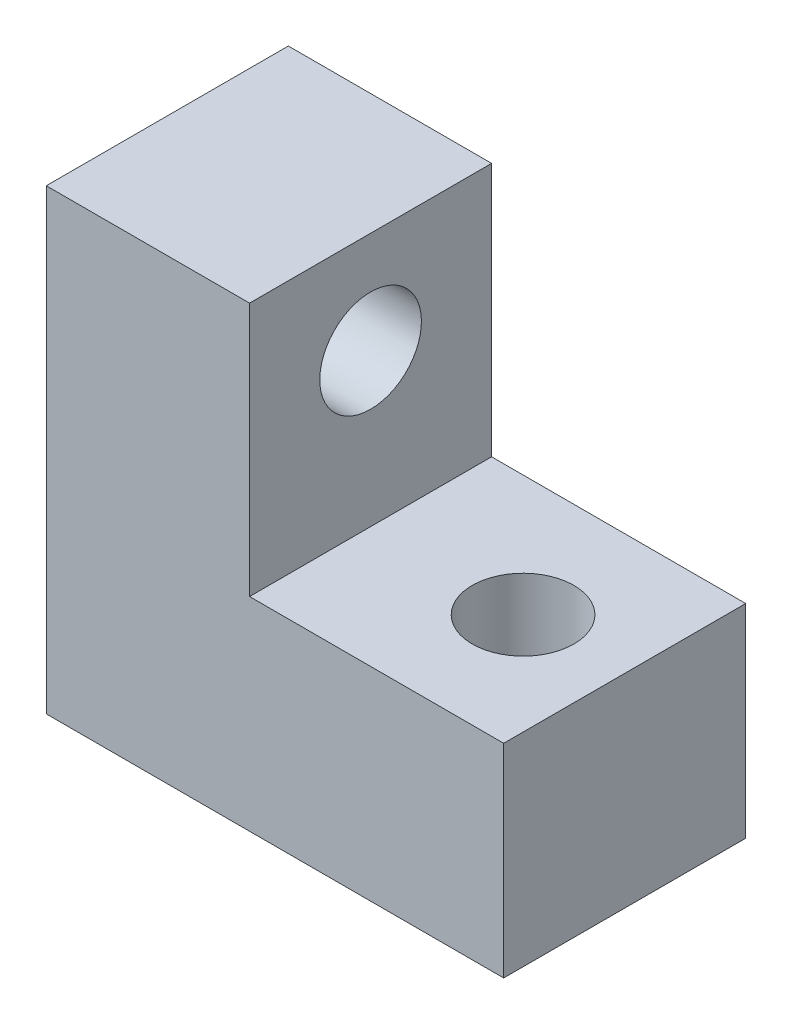
ISO-10303-21;
HEADER;
FILE_DESCRIPTION(('STEP AP214'),'2;1');
FILE_NAME('part.step','',(''),(''),'','','');
FILE_SCHEMA(('AUTOMOTIVE_DESIGN { 1 0 10303 214 1 1 1 1 }'));
ENDSEC;
DATA;
#1=APPLICATION_CONTEXT('core data for automotive mechanical design processes');
#2=APPLICATION_PROTOCOL_DEFINITION('international standard','automotive_design',2000,#1);
#3=PRODUCT_CONTEXT('',#1,'mechanical');
#4=PRODUCT('Part','Part','',(#3));
#5=PRODUCT_RELATED_PRODUCT_CATEGORY('part','',(#4));
#6=PRODUCT_DEFINITION_FORMATION('','',#4);
#7=PRODUCT_DEFINITION_CONTEXT('part definition',#1,'design');
#8=PRODUCT_DEFINITION('design','',#6,#7);
#9=PRODUCT_DEFINITION_SHAPE('','',#8);
#10=(LENGTH_UNIT() NAMED_UNIT(*) SI_UNIT(.MILLI.,.METRE.));
#11=(NAMED_UNIT(*) PLANE_ANGLE_UNIT() SI_UNIT($,.RADIAN.));
#12=(NAMED_UNIT(*) SI_UNIT($,.STERADIAN.) SOLID_ANGLE_UNIT());
#13=UNCERTAINTY_MEASURE_WITH_UNIT(LENGTH_MEASURE(1.E-05),#10,'distance_accuracy_value','');
#14=(GEOMETRIC_REPRESENTATION_CONTEXT(3) GLOBAL_UNCERTAINTY_ASSIGNED_CONTEXT((#13)) GLOBAL_UNIT_ASSIGNED_CONTEXT((#10,
#11,#12)) REPRESENTATION_CONTEXT('',''));
#15=CARTESIAN_POINT('',(0.,0.,0.));
#16=DIRECTION('',(0.,0.,1.));
#17=DIRECTION('',(1.,0.,0.));
#18=AXIS2_PLACEMENT_3D('',#15,#16,#17);
#19=CARTESIAN_POINT('',(0.,0.,9.525));
#20=DIRECTION('',(1.,0.,0.));
#21=DIRECTION('',(0.,1.,0.));
#22=AXIS2_PLACEMENT_3D('',#19,#20,#21);
#23=PLANE('',#22);
#24=CARTESIAN_POINT('',(0.,14.,4.7625));
#25=DIRECTION('',(-1.,0.,0.));
#26=DIRECTION('',(0.,-1.,0.));
#27=AXIS2_PLACEMENT_3D('',#24,#25,#26);
#28=CIRCLE('',#27,2.);
#29=CARTESIAN_POINT('',(0.,12.,4.7625));
#30=VERTEX_POINT('',#29);
#31=EDGE_CURVE('E183',#30,#30,#28,.T.);
#32=ORIENTED_EDGE('',*,*,#31,.F.);
#33=EDGE_LOOP('',(#32));
#34=FACE_BOUND('',#33,.T.);
#35=DIRECTION('',(0.,-1.,0.));
#36=VECTOR('',#35,1.);
#37=CARTESIAN_POINT('',(0.,0.,0.));
#38=LINE('',#37,#36);
#39=CARTESIAN_POINT('',(0.,18.,0.));
#40=VERTEX_POINT('',#39);
#41=CARTESIAN_POINT('',(0.,0.,0.));
#42=VERTEX_POINT('',#41);
#43=EDGE_CURVE('E128',#40,#42,#38,.T.);
#44=ORIENTED_EDGE('',*,*,#43,.T.);
#45=DIRECTION('',(0.,0.,-1.));
#46=VECTOR('',#45,1.);
#47=CARTESIAN_POINT('',(0.,0.,9.525));
#48=LINE('',#47,#46);
#49=CARTESIAN_POINT('',(0.,0.,9.525));
#50=VERTEX_POINT('',#49);
#51=EDGE_CURVE('E11',#50,#42,#48,.T.);
#52=ORIENTED_EDGE('',*,*,#51,.F.);
#53=DIRECTION('',(0.,-1.,0.));
#54=VECTOR('',#53,1.);
#55=CARTESIAN_POINT('',(0.,0.,9.525));
#56=LINE('',#55,#54);
#57=CARTESIAN_POINT('',(0.,18.,9.525));
#58=VERTEX_POINT('',#57);
#59=EDGE_CURVE('E145',#58,#50,#56,.T.);
#60=ORIENTED_EDGE('',*,*,#59,.F.);
#61=DIRECTION('',(0.,0.,-1.));
#62=VECTOR('',#61,1.);
#63=CARTESIAN_POINT('',(0.,18.,9.525));
#64=LINE('',#63,#62);
#65=EDGE_CURVE('E124',#58,#40,#64,.T.);
#66=ORIENTED_EDGE('',*,*,#65,.T.);
#67=EDGE_LOOP('',(#44,#52,#60,#66));
#68=FACE_BOUND('',#67,.T.);
#69=ADVANCED_FACE('F38',(#34,#68),#23,.F.);
#70=CARTESIAN_POINT('',(0.,0.,9.525));
#71=DIRECTION('',(0.,1.,0.));
#72=DIRECTION('',(-1.,0.,0.));
#73=AXIS2_PLACEMENT_3D('',#70,#71,#72);
#74=PLANE('',#73);
#75=CARTESIAN_POINT('',(14.,0.,4.7625));
#76=DIRECTION('',(0.,-1.,0.));
#77=DIRECTION('',(1.,0.,0.));
#78=AXIS2_PLACEMENT_3D('',#75,#76,#77);
#79=CIRCLE('',#78,2.);
#80=CARTESIAN_POINT('',(16.,0.,4.7625));
#81=VERTEX_POINT('',#80);
#82=EDGE_CURVE('E194',#81,#81,#79,.T.);
#83=ORIENTED_EDGE('',*,*,#82,.F.);
#84=EDGE_LOOP('',(#83));
#85=FACE_BOUND('',#84,.T.);
#86=DIRECTION('',(1.,0.,0.));
#87=VECTOR('',#86,1.);
#88=CARTESIAN_POINT('',(0.,0.,0.));
#89=LINE('',#88,#87);
#90=CARTESIAN_POINT('',(18.,0.,0.));
#91=VERTEX_POINT('',#90);
#92=EDGE_CURVE('E132',#42,#91,#89,.T.);
#93=ORIENTED_EDGE('',*,*,#92,.T.);
#94=DIRECTION('',(0.,0.,-1.));
#95=VECTOR('',#94,1.);
#96=CARTESIAN_POINT('',(18.,0.,9.525));
#97=LINE('',#96,#95);
#98=CARTESIAN_POINT('',(18.,0.,9.525));
#99=VERTEX_POINT('',#98);
#100=EDGE_CURVE('E47',#99,#91,#97,.T.);
#101=ORIENTED_EDGE('',*,*,#100,.F.);
#102=DIRECTION('',(1.,0.,0.));
#103=VECTOR('',#102,1.);
#104=CARTESIAN_POINT('',(0.,0.,9.525));
#105=LINE('',#104,#103);
#106=EDGE_CURVE('E92',#50,#99,#105,.T.);
#107=ORIENTED_EDGE('',*,*,#106,.F.);
#108=ORIENTED_EDGE('',*,*,#51,.T.);
#109=EDGE_LOOP('',(#93,#101,#107,#108));
#110=FACE_BOUND('',#109,.T.);
#111=ADVANCED_FACE('F175',(#85,#110),#74,.F.);
#112=CARTESIAN_POINT('',(18.,8.00000000000001,9.525));
#113=DIRECTION('',(-1.,0.,0.));
#114=DIRECTION('',(0.,-1.,0.));
#115=AXIS2_PLACEMENT_3D('',#112,#113,#114);
#116=PLANE('',#115);
#117=DIRECTION('',(0.,1.,0.));
#118=VECTOR('',#117,1.);
#119=CARTESIAN_POINT('',(18.,8.00000000000001,0.));
#120=LINE('',#119,#118);
#121=CARTESIAN_POINT('',(18.,8.00000000000001,0.));
#122=VERTEX_POINT('',#121);
#123=EDGE_CURVE('E136',#91,#122,#120,.T.);
#124=ORIENTED_EDGE('',*,*,#123,.T.);
#125=DIRECTION('',(0.,0.,-1.));
#126=VECTOR('',#125,1.);
#127=CARTESIAN_POINT('',(18.,8.00000000000001,9.525));
#128=LINE('',#127,#126);
#129=CARTESIAN_POINT('',(18.,8.00000000000001,9.525));
#130=VERTEX_POINT('',#129);
#131=EDGE_CURVE('E116',#130,#122,#128,.T.);
#132=ORIENTED_EDGE('',*,*,#131,.F.);
#133=DIRECTION('',(0.,1.,0.));
#134=VECTOR('',#133,1.);
#135=CARTESIAN_POINT('',(18.,8.00000000000001,9.525));
#136=LINE('',#135,#134);
#137=EDGE_CURVE('E105',#99,#130,#136,.T.);
#138=ORIENTED_EDGE('',*,*,#137,.F.);
#139=ORIENTED_EDGE('',*,*,#100,.T.);
#140=EDGE_LOOP('',(#124,#132,#138,#139));
#141=FACE_BOUND('',#140,.T.);
#142=ADVANCED_FACE('F156',(#141),#116,.F.);
#143=CARTESIAN_POINT('',(8.,7.99999999999999,9.525));
#144=DIRECTION('',(0.,-1.,0.));
#145=DIRECTION('',(1.,0.,0.));
#146=AXIS2_PLACEMENT_3D('',#143,#144,#145);
#147=PLANE('',#146);
#148=CARTESIAN_POINT('',(14.,8.,4.7625));
#149=DIRECTION('',(0.,-1.,0.));
#150=DIRECTION('',(1.,0.,0.));
#151=AXIS2_PLACEMENT_3D('',#148,#149,#150);
#152=CIRCLE('',#151,2.);
#153=CARTESIAN_POINT('',(16.,8.,4.7625));
#154=VERTEX_POINT('',#153);
#155=EDGE_CURVE('E186',#154,#154,#152,.F.);
#156=ORIENTED_EDGE('',*,*,#155,.F.);
#157=EDGE_LOOP('',(#156));
#158=FACE_BOUND('',#157,.T.);
#159=DIRECTION('',(-1.,0.,0.));
#160=VECTOR('',#159,1.);
#161=CARTESIAN_POINT('',(8.,7.99999999999999,0.));
#162=LINE('',#161,#160);
#163=CARTESIAN_POINT('',(8.,7.99999999999999,0.));
#164=VERTEX_POINT('',#163);
#165=EDGE_CURVE('E114',#122,#164,#162,.T.);
#166=ORIENTED_EDGE('',*,*,#165,.T.);
#167=DIRECTION('',(0.,0.,-1.));
#168=VECTOR('',#167,1.);
#169=CARTESIAN_POINT('',(8.,7.99999999999999,9.525));
#170=LINE('',#169,#168);
#171=CARTESIAN_POINT('',(8.,7.99999999999999,9.525));
#172=VERTEX_POINT('',#171);
#173=EDGE_CURVE('E111',#172,#164,#170,.T.);
#174=ORIENTED_EDGE('',*,*,#173,.F.);
#175=DIRECTION('',(-1.,0.,0.));
#176=VECTOR('',#175,1.);
#177=CARTESIAN_POINT('',(8.,7.99999999999999,9.525));
#178=LINE('',#177,#176);
#179=EDGE_CURVE('E99',#130,#172,#178,.T.);
#180=ORIENTED_EDGE('',*,*,#179,.F.);
#181=ORIENTED_EDGE('',*,*,#131,.T.);
#182=EDGE_LOOP('',(#166,#174,#180,#181));
#183=FACE_BOUND('',#182,.T.);
#184=ADVANCED_FACE('F112',(#158,#183),#147,.F.);
#185=CARTESIAN_POINT('',(8.,18.,9.525));
#186=DIRECTION('',(-1.,0.,0.));
#187=DIRECTION('',(0.,-1.,0.));
#188=AXIS2_PLACEMENT_3D('',#185,#186,#187);
#189=PLANE('',#188);
#190=CARTESIAN_POINT('',(8.,14.,4.7625));
#191=DIRECTION('',(-1.,0.,0.));
#192=DIRECTION('',(0.,-1.,0.));
#193=AXIS2_PLACEMENT_3D('',#190,#191,#192);
#194=CIRCLE('',#193,2.);
#195=CARTESIAN_POINT('',(8.,12.,4.7625));
#196=VERTEX_POINT('',#195);
#197=EDGE_CURVE('E133',#196,#196,#194,.F.);
#198=ORIENTED_EDGE('',*,*,#197,.F.);
#199=EDGE_LOOP('',(#198));
#200=FACE_BOUND('',#199,.T.);
#201=DIRECTION('',(0.,1.,0.));
#202=VECTOR('',#201,1.);
#203=CARTESIAN_POINT('',(8.,18.,0.));
#204=LINE('',#203,#202);
#205=CARTESIAN_POINT('',(8.,18.,0.));
#206=VERTEX_POINT('',#205);
#207=EDGE_CURVE('E78',#164,#206,#204,.T.);
#208=ORIENTED_EDGE('',*,*,#207,.T.);
#209=DIRECTION('',(0.,0.,-1.));
#210=VECTOR('',#209,1.);
#211=CARTESIAN_POINT('',(8.,18.,9.525));
#212=LINE('',#211,#210);
#213=CARTESIAN_POINT('',(8.,18.,9.525));
#214=VERTEX_POINT('',#213);
#215=EDGE_CURVE('E117',#214,#206,#212,.T.);
#216=ORIENTED_EDGE('',*,*,#215,.F.);
#217=DIRECTION('',(0.,1.,0.));
#218=VECTOR('',#217,1.);
#219=CARTESIAN_POINT('',(8.,18.,9.525));
#220=LINE('',#219,#218);
#221=EDGE_CURVE('E103',#172,#214,#220,.T.);
#222=ORIENTED_EDGE('',*,*,#221,.F.);
#223=ORIENTED_EDGE('',*,*,#173,.T.);
#224=EDGE_LOOP('',(#208,#216,#222,#223));
#225=FACE_BOUND('',#224,.T.);
#226=ADVANCED_FACE('F119',(#200,#225),#189,.F.);
#227=CARTESIAN_POINT('',(0.,18.,9.525));
#228=DIRECTION('',(0.,-1.,0.));
#229=DIRECTION('',(1.,0.,0.));
#230=AXIS2_PLACEMENT_3D('',#227,#228,#229);
#231=PLANE('',#230);
#232=DIRECTION('',(-1.,0.,0.));
#233=VECTOR('',#232,1.);
#234=CARTESIAN_POINT('',(0.,18.,0.));
#235=LINE('',#234,#233);
#236=EDGE_CURVE('E84',#206,#40,#235,.T.);
#237=ORIENTED_EDGE('',*,*,#236,.T.);
#238=ORIENTED_EDGE('',*,*,#65,.F.);
#239=DIRECTION('',(-1.,0.,0.));
#240=VECTOR('',#239,1.);
#241=CARTESIAN_POINT('',(0.,18.,9.525));
#242=LINE('',#241,#240);
#243=EDGE_CURVE('E55',#214,#58,#242,.T.);
#244=ORIENTED_EDGE('',*,*,#243,.F.);
#245=ORIENTED_EDGE('',*,*,#215,.T.);
#246=EDGE_LOOP('',(#237,#238,#244,#245));
#247=FACE_BOUND('',#246,.T.);
#248=ADVANCED_FACE('F163',(#247),#231,.F.);
#249=CARTESIAN_POINT('',(0.,0.,9.525));
#250=DIRECTION('',(0.,0.,-1.));
#251=DIRECTION('',(-1.,0.,0.));
#252=AXIS2_PLACEMENT_3D('',#249,#250,#251);
#253=PLANE('',#252);
#254=ORIENTED_EDGE('',*,*,#59,.T.);
#255=ORIENTED_EDGE('',*,*,#106,.T.);
#256=ORIENTED_EDGE('',*,*,#137,.T.);
#257=ORIENTED_EDGE('',*,*,#179,.T.);
#258=ORIENTED_EDGE('',*,*,#221,.T.);
#259=ORIENTED_EDGE('',*,*,#243,.T.);
#260=EDGE_LOOP('',(#254,#255,#256,#257,#258,#259));
#261=FACE_BOUND('',#260,.T.);
#262=ADVANCED_FACE('F101',(#261),#253,.F.);
#263=CARTESIAN_POINT('',(0.,0.,0.));
#264=DIRECTION('',(0.,0.,-1.));
#265=DIRECTION('',(-1.,0.,0.));
#266=AXIS2_PLACEMENT_3D('',#263,#264,#265);
#267=PLANE('',#266);
#268=ORIENTED_EDGE('',*,*,#43,.F.);
#269=ORIENTED_EDGE('',*,*,#236,.F.);
#270=ORIENTED_EDGE('',*,*,#207,.F.);
#271=ORIENTED_EDGE('',*,*,#165,.F.);
#272=ORIENTED_EDGE('',*,*,#123,.F.);
#273=ORIENTED_EDGE('',*,*,#92,.F.);
#274=EDGE_LOOP('',(#268,#269,#270,#271,#272,#273));
#275=FACE_BOUND('',#274,.T.);
#276=ADVANCED_FACE('F159',(#275),#267,.T.);
#277=CARTESIAN_POINT('',(13.6568542494924,14.,4.7625));
#278=DIRECTION('',(-1.,0.,0.));
#279=DIRECTION('',(0.,-1.,0.));
#280=AXIS2_PLACEMENT_3D('',#277,#278,#279);
#281=CYLINDRICAL_SURFACE('',#280,2.);
#282=ORIENTED_EDGE('',*,*,#197,.T.);
#283=EDGE_LOOP('',(#282));
#284=FACE_BOUND('',#283,.T.);
#285=ORIENTED_EDGE('',*,*,#31,.T.);
#286=EDGE_LOOP('',(#285));
#287=FACE_BOUND('',#286,.T.);
#288=ADVANCED_FACE('F220',(#284,#287),#281,.F.);
#289=CARTESIAN_POINT('',(14.,13.6568542494924,4.7625));
#290=DIRECTION('',(0.,-1.,0.));
#291=DIRECTION('',(1.,0.,0.));
#292=AXIS2_PLACEMENT_3D('',#289,#290,#291);
#293=CYLINDRICAL_SURFACE('',#292,2.);
#294=ORIENTED_EDGE('',*,*,#155,.T.);
#295=EDGE_LOOP('',(#294));
#296=FACE_BOUND('',#295,.T.);
#297=ORIENTED_EDGE('',*,*,#82,.T.);
#298=EDGE_LOOP('',(#297));
#299=FACE_BOUND('',#298,.T.);
#300=ADVANCED_FACE('F218',(#296,#299),#293,.F.);
#301=CLOSED_SHELL('',(#69,#111,#142,#184,#226,#248,#262,#276,#288,#300));
#302=MANIFOLD_SOLID_BREP('B2',#301);
#303=ADVANCED_BREP_SHAPE_REPRESENTATION('',(#18,#302),#14);
#304=SHAPE_DEFINITION_REPRESENTATION(#9,#303);
ENDSEC;
END-ISO-10303-21;
